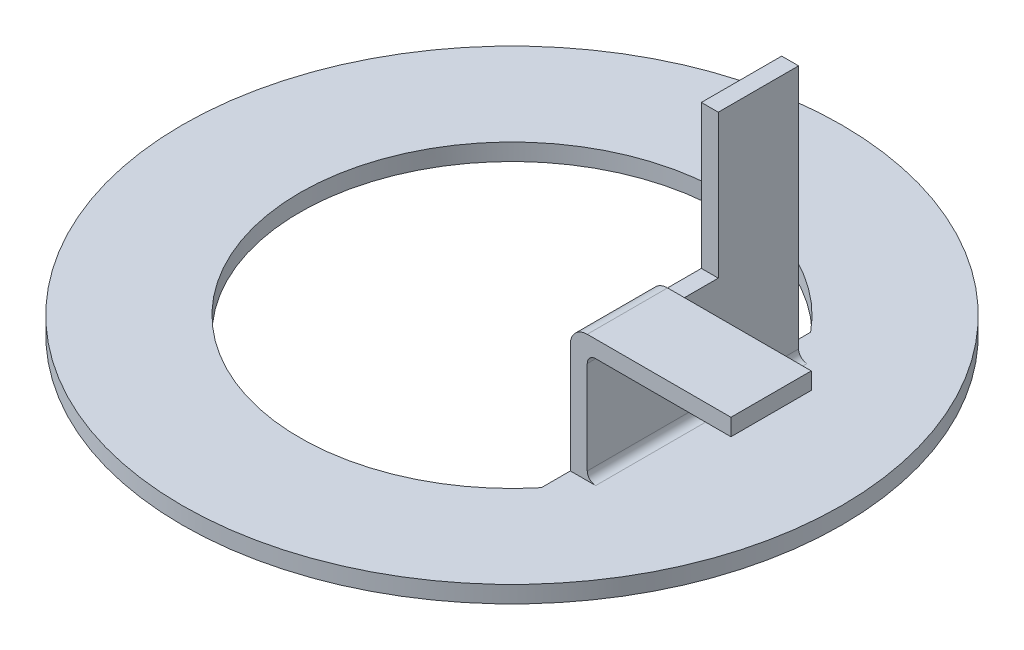
ISO-10303-21;
HEADER;
FILE_DESCRIPTION(('STEP AP214'),'2;1');
FILE_NAME('part.step','',(''),(''),'','','');
FILE_SCHEMA(('AUTOMOTIVE_DESIGN { 1 0 10303 214 1 1 1 1 }'));
ENDSEC;
DATA;
#1=APPLICATION_CONTEXT('core data for automotive mechanical design processes');
#2=APPLICATION_PROTOCOL_DEFINITION('international standard','automotive_design',2000,#1);
#3=PRODUCT_CONTEXT('',#1,'mechanical');
#4=PRODUCT('Part','Part','',(#3));
#5=PRODUCT_RELATED_PRODUCT_CATEGORY('part','',(#4));
#6=PRODUCT_DEFINITION_FORMATION('','',#4);
#7=PRODUCT_DEFINITION_CONTEXT('part definition',#1,'design');
#8=PRODUCT_DEFINITION('design','',#6,#7);
#9=PRODUCT_DEFINITION_SHAPE('','',#8);
#10=(LENGTH_UNIT() NAMED_UNIT(*) SI_UNIT(.MILLI.,.METRE.));
#11=(NAMED_UNIT(*) PLANE_ANGLE_UNIT() SI_UNIT($,.RADIAN.));
#12=(NAMED_UNIT(*) SI_UNIT($,.STERADIAN.) SOLID_ANGLE_UNIT());
#13=UNCERTAINTY_MEASURE_WITH_UNIT(LENGTH_MEASURE(1.E-05),#10,'distance_accuracy_value','');
#14=(GEOMETRIC_REPRESENTATION_CONTEXT(3) GLOBAL_UNCERTAINTY_ASSIGNED_CONTEXT((#13)) GLOBAL_UNIT_ASSIGNED_CONTEXT((#10,
#11,#12)) REPRESENTATION_CONTEXT('',''));
#15=CARTESIAN_POINT('',(0.,0.,0.));
#16=DIRECTION('',(0.,0.,1.));
#17=DIRECTION('',(1.,0.,0.));
#18=AXIS2_PLACEMENT_3D('',#15,#16,#17);
#19=CARTESIAN_POINT('',(9.85520000000012,8.6360000000002,1.52399999999986));
#20=DIRECTION('',(0.,0.,1.));
#21=DIRECTION('',(1.,0.,0.));
#22=AXIS2_PLACEMENT_3D('',#19,#20,#21);
#23=PLANE('',#22);
#24=CARTESIAN_POINT('',(10.8711999999994,7.62000000000007,1.52400000000008));
#25=DIRECTION('',(0.,0.,1.));
#26=DIRECTION('',(1.,0.,0.));
#27=AXIS2_PLACEMENT_3D('',#24,#25,#26);
#28=CIRCLE('',#27,1.016);
#29=CARTESIAN_POINT('',(10.8711999999996,8.63600000000009,1.52399999999986));
#30=VERTEX_POINT('',#29);
#31=CARTESIAN_POINT('',(9.85519999999934,7.61999999999996,1.52399999999964));
#32=VERTEX_POINT('',#31);
#33=EDGE_CURVE('E20',#30,#32,#28,.T.);
#34=ORIENTED_EDGE('',*,*,#33,.F.);
#35=DIRECTION('',(1.,0.,0.));
#36=VECTOR('',#35,1.);
#37=CARTESIAN_POINT('',(9.85520000000012,8.6360000000002,1.52399999999986));
#38=LINE('',#37,#36);
#39=CARTESIAN_POINT('',(19.5071999999998,8.6360000000002,1.52400000000008));
#40=VERTEX_POINT('',#39);
#41=EDGE_CURVE('E93',#40,#30,#38,.F.);
#42=ORIENTED_EDGE('',*,*,#41,.F.);
#43=DIRECTION('',(0.,1.,0.));
#44=VECTOR('',#43,1.);
#45=CARTESIAN_POINT('',(19.5071999999998,8.6360000000002,1.52400000000008));
#46=LINE('',#45,#44);
#47=CARTESIAN_POINT('',(19.5071999999998,7.61999999999996,1.52399999999986));
#48=VERTEX_POINT('',#47);
#49=EDGE_CURVE('E145',#40,#48,#46,.F.);
#50=ORIENTED_EDGE('',*,*,#49,.T.);
#51=DIRECTION('',(1.,0.,0.));
#52=VECTOR('',#51,1.);
#53=CARTESIAN_POINT('',(9.85519999999934,7.61999999999996,1.52399999999964));
#54=LINE('',#53,#52);
#55=CARTESIAN_POINT('',(11.3791999999996,7.62000000000018,1.5240000000003));
#56=VERTEX_POINT('',#55);
#57=EDGE_CURVE('E135',#48,#56,#54,.F.);
#58=ORIENTED_EDGE('',*,*,#57,.T.);
#59=CARTESIAN_POINT('',(11.3791999999996,7.11200000000045,1.5240000000003));
#60=DIRECTION('',(0.,0.,-1.));
#61=DIRECTION('',(-1.,0.,0.));
#62=AXIS2_PLACEMENT_3D('',#59,#60,#61);
#63=CIRCLE('',#62,0.508);
#64=CARTESIAN_POINT('',(10.8711999999996,7.11200000000012,1.52399999999986));
#65=VERTEX_POINT('',#64);
#66=EDGE_CURVE('E139',#56,#65,#63,.F.);
#67=ORIENTED_EDGE('',*,*,#66,.T.);
#68=DIRECTION('',(0.,1.,0.));
#69=VECTOR('',#68,1.);
#70=CARTESIAN_POINT('',(10.8711999999996,8.63600000000009,1.52399999999986));
#71=LINE('',#70,#69);
#72=CARTESIAN_POINT('',(10.8711999999994,7.62000000000007,1.52400000000008));
#73=VERTEX_POINT('',#72);
#74=EDGE_CURVE('E101',#73,#65,#71,.F.);
#75=ORIENTED_EDGE('',*,*,#74,.F.);
#76=DIRECTION('',(1.,0.,0.));
#77=VECTOR('',#76,1.);
#78=CARTESIAN_POINT('',(9.85519999999934,7.61999999999996,1.52399999999964));
#79=LINE('',#78,#77);
#80=EDGE_CURVE('E96',#32,#73,#79,.T.);
#81=ORIENTED_EDGE('',*,*,#80,.F.);
#82=EDGE_LOOP('',(#34,#42,#50,#58,#67,#75,#81));
#83=FACE_BOUND('',#82,.T.);
#84=ADVANCED_FACE('F17',(#83),#23,.F.);
#85=CARTESIAN_POINT('',(19.5071999999998,8.6360000000002,1.52400000000008));
#86=DIRECTION('',(-1.,0.,0.));
#87=DIRECTION('',(0.,0.,1.));
#88=AXIS2_PLACEMENT_3D('',#85,#86,#87);
#89=PLANE('',#88);
#90=ORIENTED_EDGE('',*,*,#49,.F.);
#91=DIRECTION('',(0.,0.,1.));
#92=VECTOR('',#91,1.);
#93=CARTESIAN_POINT('',(19.5071999999998,8.63600000000031,6.3500000000003));
#94=LINE('',#93,#92);
#95=CARTESIAN_POINT('',(19.5071999999998,8.63600000000031,6.3500000000003));
#96=VERTEX_POINT('',#95);
#97=EDGE_CURVE('E109',#96,#40,#94,.F.);
#98=ORIENTED_EDGE('',*,*,#97,.F.);
#99=DIRECTION('',(0.,1.,0.));
#100=VECTOR('',#99,1.);
#101=CARTESIAN_POINT('',(19.5071999999998,8.63600000000031,6.3500000000003));
#102=LINE('',#101,#100);
#103=CARTESIAN_POINT('',(19.5071999999998,7.62000000000029,6.34999999999986));
#104=VERTEX_POINT('',#103);
#105=EDGE_CURVE('E142',#104,#96,#102,.T.);
#106=ORIENTED_EDGE('',*,*,#105,.F.);
#107=DIRECTION('',(0.,0.,1.));
#108=VECTOR('',#107,1.);
#109=CARTESIAN_POINT('',(19.5071999999998,7.62000000000029,6.34999999999986));
#110=LINE('',#109,#108);
#111=EDGE_CURVE('E136',#104,#48,#110,.F.);
#112=ORIENTED_EDGE('',*,*,#111,.T.);
#113=EDGE_LOOP('',(#90,#98,#106,#112));
#114=FACE_BOUND('',#113,.T.);
#115=ADVANCED_FACE('F247',(#114),#89,.F.);
#116=CARTESIAN_POINT('',(11.3791999999996,7.11200000000067,-6.34999999999986));
#117=DIRECTION('',(0.,0.,-1.));
#118=DIRECTION('',(-1.,0.,0.));
#119=AXIS2_PLACEMENT_3D('',#116,#117,#118);
#120=CYLINDRICAL_SURFACE('',#119,0.508);
#121=DIRECTION('',(0.,0.,1.));
#122=VECTOR('',#121,1.);
#123=CARTESIAN_POINT('',(11.3791999999999,7.61999999999996,6.35000000000008));
#124=LINE('',#123,#122);
#125=CARTESIAN_POINT('',(11.3791999999999,7.61999999999996,6.35000000000008));
#126=VERTEX_POINT('',#125);
#127=EDGE_CURVE('E110',#56,#126,#124,.T.);
#128=ORIENTED_EDGE('',*,*,#127,.T.);
#129=CARTESIAN_POINT('',(11.3791999999988,7.1119999999999,6.34999999999986));
#130=DIRECTION('',(0.,0.,-1.));
#131=DIRECTION('',(-1.,0.,0.));
#132=AXIS2_PLACEMENT_3D('',#129,#130,#131);
#133=CIRCLE('',#132,0.508);
#134=CARTESIAN_POINT('',(10.8711999999992,7.11200000000023,6.34999999999986));
#135=VERTEX_POINT('',#134);
#136=EDGE_CURVE('E149',#135,#126,#133,.T.);
#137=ORIENTED_EDGE('',*,*,#136,.F.);
#138=DIRECTION('',(0.,0.,1.));
#139=VECTOR('',#138,1.);
#140=CARTESIAN_POINT('',(10.8711999999997,7.11200000000056,-6.35000000000008));
#141=LINE('',#140,#139);
#142=EDGE_CURVE('E127',#135,#65,#141,.F.);
#143=ORIENTED_EDGE('',*,*,#142,.T.);
#144=ORIENTED_EDGE('',*,*,#66,.F.);
#145=EDGE_LOOP('',(#128,#137,#143,#144));
#146=FACE_BOUND('',#145,.T.);
#147=ADVANCED_FACE('F244',(#146),#120,.F.);
#148=CARTESIAN_POINT('',(9.8551999999994,7.62000000000007,6.34999999999963));
#149=DIRECTION('',(0.,1.,0.));
#150=DIRECTION('',(0.,0.,1.));
#151=AXIS2_PLACEMENT_3D('',#148,#149,#150);
#152=PLANE('',#151);
#153=ORIENTED_EDGE('',*,*,#127,.F.);
#154=ORIENTED_EDGE('',*,*,#57,.F.);
#155=ORIENTED_EDGE('',*,*,#111,.F.);
#156=DIRECTION('',(-1.,0.,0.));
#157=VECTOR('',#156,1.);
#158=CARTESIAN_POINT('',(9.8551999999994,7.62000000000007,6.34999999999963));
#159=LINE('',#158,#157);
#160=EDGE_CURVE('E306',#104,#126,#159,.T.);
#161=ORIENTED_EDGE('',*,*,#160,.T.);
#162=EDGE_LOOP('',(#153,#154,#155,#161));
#163=FACE_BOUND('',#162,.T.);
#164=ADVANCED_FACE('F241',(#163),#152,.F.);
#165=CARTESIAN_POINT('',(9.85519999999973,8.63600000000009,6.34999999999986));
#166=DIRECTION('',(0.,1.,0.));
#167=DIRECTION('',(0.,0.,1.));
#168=AXIS2_PLACEMENT_3D('',#165,#166,#167);
#169=PLANE('',#168);
#170=DIRECTION('',(-1.,0.,0.));
#171=VECTOR('',#170,1.);
#172=CARTESIAN_POINT('',(9.85519999999973,8.63600000000009,6.34999999999986));
#173=LINE('',#172,#171);
#174=CARTESIAN_POINT('',(10.8711999999994,8.6360000000002,6.34999999999986));
#175=VERTEX_POINT('',#174);
#176=EDGE_CURVE('E121',#175,#96,#173,.F.);
#177=ORIENTED_EDGE('',*,*,#176,.T.);
#178=ORIENTED_EDGE('',*,*,#97,.T.);
#179=ORIENTED_EDGE('',*,*,#41,.T.);
#180=DIRECTION('',(0.,0.,1.));
#181=VECTOR('',#180,1.);
#182=CARTESIAN_POINT('',(10.8711999999994,8.6360000000002,6.34999999999986));
#183=LINE('',#182,#181);
#184=EDGE_CURVE('E107',#175,#30,#183,.F.);
#185=ORIENTED_EDGE('',*,*,#184,.F.);
#186=EDGE_LOOP('',(#177,#178,#179,#185));
#187=FACE_BOUND('',#186,.T.);
#188=ADVANCED_FACE('F106',(#187),#169,.T.);
#189=CARTESIAN_POINT('',(10.8711999999997,16.2560000000003,-6.35000000000008));
#190=DIRECTION('',(-1.,0.,0.));
#191=DIRECTION('',(0.,0.,1.));
#192=AXIS2_PLACEMENT_3D('',#189,#190,#191);
#193=PLANE('',#192);
#194=ORIENTED_EDGE('',*,*,#142,.F.);
#195=DIRECTION('',(0.,1.,0.));
#196=VECTOR('',#195,1.);
#197=CARTESIAN_POINT('',(10.8711999999996,16.256,6.3500000000003));
#198=LINE('',#197,#196);
#199=CARTESIAN_POINT('',(10.8711999999992,1.52400000000041,6.35000000000008));
#200=VERTEX_POINT('',#199);
#201=EDGE_CURVE('E301',#135,#200,#198,.F.);
#202=ORIENTED_EDGE('',*,*,#201,.T.);
#203=DIRECTION('',(0.,0.,-1.));
#204=VECTOR('',#203,1.);
#205=CARTESIAN_POINT('',(10.8711999999997,1.52400000000019,-6.35000000000008));
#206=LINE('',#205,#204);
#207=CARTESIAN_POINT('',(10.8711999999997,1.52400000000019,-6.35000000000008));
#208=VERTEX_POINT('',#207);
#209=EDGE_CURVE('E330',#200,#208,#206,.T.);
#210=ORIENTED_EDGE('',*,*,#209,.T.);
#211=DIRECTION('',(0.,1.,0.));
#212=VECTOR('',#211,1.);
#213=CARTESIAN_POINT('',(10.8711999999997,16.2560000000003,-6.35000000000008));
#214=LINE('',#213,#212);
#215=CARTESIAN_POINT('',(10.8711999999997,16.2560000000003,-6.35000000000008));
#216=VERTEX_POINT('',#215);
#217=EDGE_CURVE('E132',#208,#216,#214,.T.);
#218=ORIENTED_EDGE('',*,*,#217,.T.);
#219=DIRECTION('',(0.,0.,1.));
#220=VECTOR('',#219,1.);
#221=CARTESIAN_POINT('',(10.8711999999996,16.256,6.3500000000003));
#222=LINE('',#221,#220);
#223=CARTESIAN_POINT('',(10.8712,16.2560000000003,-1.52399999999986));
#224=VERTEX_POINT('',#223);
#225=EDGE_CURVE('E331',#224,#216,#222,.F.);
#226=ORIENTED_EDGE('',*,*,#225,.F.);
#227=DIRECTION('',(0.,1.,0.));
#228=VECTOR('',#227,1.);
#229=CARTESIAN_POINT('',(10.8711999999993,17.4047218500607,-1.52400000000052));
#230=LINE('',#229,#228);
#231=CARTESIAN_POINT('',(10.8711999999998,7.62000000000029,-1.52400000000008));
#232=VERTEX_POINT('',#231);
#233=EDGE_CURVE('E119',#224,#232,#230,.F.);
#234=ORIENTED_EDGE('',*,*,#233,.T.);
#235=DIRECTION('',(0.,0.,-1.));
#236=VECTOR('',#235,1.);
#237=CARTESIAN_POINT('',(10.8711999999998,7.62000000000029,-1.52400000000008));
#238=LINE('',#237,#236);
#239=EDGE_CURVE('E116',#232,#73,#238,.F.);
#240=ORIENTED_EDGE('',*,*,#239,.T.);
#241=ORIENTED_EDGE('',*,*,#74,.T.);
#242=EDGE_LOOP('',(#194,#202,#210,#218,#226,#234,#240,#241));
#243=FACE_BOUND('',#242,.T.);
#244=ADVANCED_FACE('F234',(#243),#193,.F.);
#245=CARTESIAN_POINT('',(9.85519999999929,16.256,-6.3500000000003));
#246=DIRECTION('',(0.,0.,1.));
#247=DIRECTION('',(1.,0.,0.));
#248=AXIS2_PLACEMENT_3D('',#245,#246,#247);
#249=PLANE('',#248);
#250=DIRECTION('',(0.,1.,0.));
#251=VECTOR('',#250,1.);
#252=CARTESIAN_POINT('',(9.85519999999945,1.01599999999991,-6.34999999999986));
#253=LINE('',#252,#251);
#254=CARTESIAN_POINT('',(9.85519999999929,16.256,-6.3500000000003));
#255=VERTEX_POINT('',#254);
#256=CARTESIAN_POINT('',(9.85519999999945,1.01599999999991,-6.34999999999986));
#257=VERTEX_POINT('',#256);
#258=EDGE_CURVE('E287',#255,#257,#253,.F.);
#259=ORIENTED_EDGE('',*,*,#258,.F.);
#260=DIRECTION('',(1.,0.,0.));
#261=VECTOR('',#260,1.);
#262=CARTESIAN_POINT('',(9.85519999999929,16.256,-6.3500000000003));
#263=LINE('',#262,#261);
#264=EDGE_CURVE('E327',#216,#255,#263,.F.);
#265=ORIENTED_EDGE('',*,*,#264,.F.);
#266=ORIENTED_EDGE('',*,*,#217,.F.);
#267=CARTESIAN_POINT('',(11.3791999999992,1.5240000000003,-6.34999999999986));
#268=DIRECTION('',(0.,0.,-1.));
#269=DIRECTION('',(-1.,0.,0.));
#270=AXIS2_PLACEMENT_3D('',#267,#268,#269);
#271=CIRCLE('',#270,0.508);
#272=CARTESIAN_POINT('',(11.3791999999992,1.01600000000046,-6.34999999999986));
#273=VERTEX_POINT('',#272);
#274=EDGE_CURVE('E339',#208,#273,#271,.F.);
#275=ORIENTED_EDGE('',*,*,#274,.T.);
#276=DIRECTION('',(1.,0.,0.));
#277=VECTOR('',#276,1.);
#278=CARTESIAN_POINT('',(9.85519999999945,1.01599999999991,-6.34999999999986));
#279=LINE('',#278,#277);
#280=EDGE_CURVE('E309',#257,#273,#279,.T.);
#281=ORIENTED_EDGE('',*,*,#280,.F.);
#282=EDGE_LOOP('',(#259,#265,#266,#275,#281));
#283=FACE_BOUND('',#282,.T.);
#284=ADVANCED_FACE('F230',(#283),#249,.F.);
#285=CARTESIAN_POINT('',(9.8551999999994,16.2560000000002,6.34999999999963));
#286=DIRECTION('',(0.,0.,-1.));
#287=DIRECTION('',(-1.,0.,0.));
#288=AXIS2_PLACEMENT_3D('',#285,#286,#287);
#289=PLANE('',#288);
#290=CARTESIAN_POINT('',(10.8711999999997,7.62000000000018,6.34999999999986));
#291=DIRECTION('',(0.,0.,1.));
#292=DIRECTION('',(1.,0.,0.));
#293=AXIS2_PLACEMENT_3D('',#290,#291,#292);
#294=CIRCLE('',#293,1.016);
#295=CARTESIAN_POINT('',(9.8551999999994,7.62000000000007,6.34999999999963));
#296=VERTEX_POINT('',#295);
#297=EDGE_CURVE('E115',#296,#175,#294,.F.);
#298=ORIENTED_EDGE('',*,*,#297,.F.);
#299=DIRECTION('',(0.,1.,0.));
#300=VECTOR('',#299,1.);
#301=CARTESIAN_POINT('',(9.85519999999956,1.01599999999991,6.3500000000003));
#302=LINE('',#301,#300);
#303=CARTESIAN_POINT('',(9.85519999999956,1.01599999999991,6.3500000000003));
#304=VERTEX_POINT('',#303);
#305=EDGE_CURVE('E285',#304,#296,#302,.T.);
#306=ORIENTED_EDGE('',*,*,#305,.F.);
#307=DIRECTION('',(-1.,0.,0.));
#308=VECTOR('',#307,1.);
#309=CARTESIAN_POINT('',(9.85519999999956,1.01599999999991,6.3500000000003));
#310=LINE('',#309,#308);
#311=CARTESIAN_POINT('',(11.3792,1.01600000000002,6.34999999999986));
#312=VERTEX_POINT('',#311);
#313=EDGE_CURVE('E296',#312,#304,#310,.T.);
#314=ORIENTED_EDGE('',*,*,#313,.F.);
#315=CARTESIAN_POINT('',(11.3791999999988,1.52399999999986,6.3500000000003));
#316=DIRECTION('',(0.,0.,-1.));
#317=DIRECTION('',(-1.,0.,0.));
#318=AXIS2_PLACEMENT_3D('',#315,#316,#317);
#319=CIRCLE('',#318,0.508);
#320=EDGE_CURVE('E292',#312,#200,#319,.T.);
#321=ORIENTED_EDGE('',*,*,#320,.T.);
#322=ORIENTED_EDGE('',*,*,#201,.F.);
#323=ORIENTED_EDGE('',*,*,#136,.T.);
#324=ORIENTED_EDGE('',*,*,#160,.F.);
#325=ORIENTED_EDGE('',*,*,#105,.T.);
#326=ORIENTED_EDGE('',*,*,#176,.F.);
#327=EDGE_LOOP('',(#298,#306,#314,#321,#322,#323,#324,#325,#326));
#328=FACE_BOUND('',#327,.T.);
#329=ADVANCED_FACE('F227',(#328),#289,.F.);
#330=CARTESIAN_POINT('',(10.8711999999997,7.62000000000018,6.34999999999986));
#331=DIRECTION('',(0.,0.,1.));
#332=DIRECTION('',(1.,0.,0.));
#333=AXIS2_PLACEMENT_3D('',#330,#331,#332);
#334=CYLINDRICAL_SURFACE('',#333,1.016);
#335=ORIENTED_EDGE('',*,*,#297,.T.);
#336=ORIENTED_EDGE('',*,*,#184,.T.);
#337=ORIENTED_EDGE('',*,*,#33,.T.);
#338=DIRECTION('',(0.,0.,1.));
#339=VECTOR('',#338,1.);
#340=CARTESIAN_POINT('',(9.85519999999956,7.62000000000007,8.0906077398426));
#341=LINE('',#340,#339);
#342=EDGE_CURVE('E168',#296,#32,#341,.F.);
#343=ORIENTED_EDGE('',*,*,#342,.F.);
#344=EDGE_LOOP('',(#335,#336,#337,#343));
#345=FACE_BOUND('',#344,.T.);
#346=ADVANCED_FACE('F113',(#345),#334,.T.);
#347=CARTESIAN_POINT('',(25.0951999999992,7.62000000000007,-1.52399999999986));
#348=DIRECTION('',(0.,-1.,0.));
#349=DIRECTION('',(0.,0.,-1.));
#350=AXIS2_PLACEMENT_3D('',#347,#348,#349);
#351=PLANE('',#350);
#352=ORIENTED_EDGE('',*,*,#239,.F.);
#353=DIRECTION('',(1.,0.,0.));
#354=VECTOR('',#353,1.);
#355=CARTESIAN_POINT('',(25.0951999999992,7.62000000000007,-1.52399999999986));
#356=LINE('',#355,#354);
#357=CARTESIAN_POINT('',(9.85520000000001,7.62000000000052,-1.5240000000003));
#358=VERTEX_POINT('',#357);
#359=EDGE_CURVE('E347',#232,#358,#356,.F.);
#360=ORIENTED_EDGE('',*,*,#359,.T.);
#361=DIRECTION('',(0.,0.,1.));
#362=VECTOR('',#361,1.);
#363=CARTESIAN_POINT('',(9.85519999999956,7.62000000000007,8.0906077398426));
#364=LINE('',#363,#362);
#365=EDGE_CURVE('E164',#32,#358,#364,.F.);
#366=ORIENTED_EDGE('',*,*,#365,.F.);
#367=ORIENTED_EDGE('',*,*,#80,.T.);
#368=EDGE_LOOP('',(#352,#360,#366,#367));
#369=FACE_BOUND('',#368,.T.);
#370=ADVANCED_FACE('F220',(#369),#351,.F.);
#371=CARTESIAN_POINT('',(25.0951999999998,17.4047218500605,-1.52400000000008));
#372=DIRECTION('',(0.,0.,-1.));
#373=DIRECTION('',(0.,1.,0.));
#374=AXIS2_PLACEMENT_3D('',#371,#372,#373);
#375=PLANE('',#374);
#376=DIRECTION('',(0.,1.,0.));
#377=VECTOR('',#376,1.);
#378=CARTESIAN_POINT('',(9.85519999999934,1.01600000000057,-1.5240000000003));
#379=LINE('',#378,#377);
#380=CARTESIAN_POINT('',(9.85519999999967,16.2560000000003,-1.52400000000008));
#381=VERTEX_POINT('',#380);
#382=EDGE_CURVE('E167',#358,#381,#379,.T.);
#383=ORIENTED_EDGE('',*,*,#382,.F.);
#384=ORIENTED_EDGE('',*,*,#359,.F.);
#385=ORIENTED_EDGE('',*,*,#233,.F.);
#386=DIRECTION('',(1.,0.,0.));
#387=VECTOR('',#386,1.);
#388=CARTESIAN_POINT('',(9.85519999999967,16.2560000000003,-1.52400000000008));
#389=LINE('',#388,#387);
#390=EDGE_CURVE('E342',#381,#224,#389,.T.);
#391=ORIENTED_EDGE('',*,*,#390,.F.);
#392=EDGE_LOOP('',(#383,#384,#385,#391));
#393=FACE_BOUND('',#392,.T.);
#394=ADVANCED_FACE('F216',(#393),#375,.F.);
#395=CARTESIAN_POINT('',(9.8551999999994,16.2560000000002,6.34999999999963));
#396=DIRECTION('',(0.,1.,0.));
#397=DIRECTION('',(0.,0.,1.));
#398=AXIS2_PLACEMENT_3D('',#395,#396,#397);
#399=PLANE('',#398);
#400=ORIENTED_EDGE('',*,*,#264,.T.);
#401=DIRECTION('',(0.,0.,1.));
#402=VECTOR('',#401,1.);
#403=CARTESIAN_POINT('',(9.85519999999934,16.2560000000003,8.0906077398426));
#404=LINE('',#403,#402);
#405=EDGE_CURVE('E321',#381,#255,#404,.F.);
#406=ORIENTED_EDGE('',*,*,#405,.F.);
#407=ORIENTED_EDGE('',*,*,#390,.T.);
#408=ORIENTED_EDGE('',*,*,#225,.T.);
#409=EDGE_LOOP('',(#400,#406,#407,#408));
#410=FACE_BOUND('',#409,.T.);
#411=ADVANCED_FACE('F212',(#410),#399,.T.);
#412=CARTESIAN_POINT('',(11.3791999999992,1.5240000000003,-6.34999999999986));
#413=DIRECTION('',(0.,0.,-1.));
#414=DIRECTION('',(-1.,0.,0.));
#415=AXIS2_PLACEMENT_3D('',#412,#413,#414);
#416=CYLINDRICAL_SURFACE('',#415,0.508);
#417=DIRECTION('',(0.,0.,1.));
#418=VECTOR('',#417,1.);
#419=CARTESIAN_POINT('',(11.3791999999997,1.01600000000024,0.));
#420=LINE('',#419,#418);
#421=EDGE_CURVE('E324',#273,#312,#420,.T.);
#422=ORIENTED_EDGE('',*,*,#421,.F.);
#423=ORIENTED_EDGE('',*,*,#274,.F.);
#424=ORIENTED_EDGE('',*,*,#209,.F.);
#425=ORIENTED_EDGE('',*,*,#320,.F.);
#426=EDGE_LOOP('',(#422,#423,#424,#425));
#427=FACE_BOUND('',#426,.T.);
#428=ADVANCED_FACE('F208',(#427),#416,.F.);
#429=CARTESIAN_POINT('',(9.85519999999934,1.01600000000013,8.09060773984283));
#430=DIRECTION('',(-1.,0.,0.));
#431=DIRECTION('',(0.,0.,1.));
#432=AXIS2_PLACEMENT_3D('',#429,#430,#431);
#433=PLANE('',#432);
#434=ORIENTED_EDGE('',*,*,#382,.T.);
#435=ORIENTED_EDGE('',*,*,#405,.T.);
#436=ORIENTED_EDGE('',*,*,#258,.T.);
#437=DIRECTION('',(0.,0.,1.));
#438=VECTOR('',#437,1.);
#439=CARTESIAN_POINT('',(9.85519999999951,1.01600000000035,2.22044604925031E-13));
#440=LINE('',#439,#438);
#441=EDGE_CURVE('E273',#304,#257,#440,.F.);
#442=ORIENTED_EDGE('',*,*,#441,.F.);
#443=ORIENTED_EDGE('',*,*,#305,.T.);
#444=ORIENTED_EDGE('',*,*,#342,.T.);
#445=ORIENTED_EDGE('',*,*,#365,.T.);
#446=EDGE_LOOP('',(#434,#435,#436,#442,#443,#444,#445));
#447=FACE_BOUND('',#446,.T.);
#448=ADVANCED_FACE('F204',(#447),#433,.T.);
#449=CARTESIAN_POINT('',(0.,1.01600000000013,0.));
#450=DIRECTION('',(0.,1.,0.));
#451=DIRECTION('',(0.,0.,1.));
#452=AXIS2_PLACEMENT_3D('',#449,#450,#451);
#453=PLANE('',#452);
#454=CARTESIAN_POINT('',(0.,1.01600000000013,0.));
#455=DIRECTION('',(0.,-1.,0.));
#456=DIRECTION('',(0.,0.,-1.));
#457=AXIS2_PLACEMENT_3D('',#454,#455,#456);
#458=CIRCLE('',#457,19.812);
#459=CARTESIAN_POINT('',(0.,1.01600000000013,-19.812));
#460=VERTEX_POINT('',#459);
#461=EDGE_CURVE('E336',#460,#460,#458,.T.);
#462=ORIENTED_EDGE('',*,*,#461,.F.);
#463=EDGE_LOOP('',(#462));
#464=FACE_BOUND('',#463,.T.);
#465=CARTESIAN_POINT('',(0.,1.01600000000013,0.));
#466=DIRECTION('',(0.,-1.,0.));
#467=DIRECTION('',(0.,0.,-1.));
#468=AXIS2_PLACEMENT_3D('',#465,#466,#467);
#469=CIRCLE('',#468,12.7508);
#470=CARTESIAN_POINT('',(9.85519999999934,1.01600000000013,8.09060773984283));
#471=VERTEX_POINT('',#470);
#472=CARTESIAN_POINT('',(9.85519999999984,1.01600000000002,-8.09060773984283));
#473=VERTEX_POINT('',#472);
#474=EDGE_CURVE('E275',#471,#473,#469,.T.);
#475=ORIENTED_EDGE('',*,*,#474,.T.);
#476=DIRECTION('',(0.,0.,1.));
#477=VECTOR('',#476,1.);
#478=CARTESIAN_POINT('',(9.85519999999951,1.01600000000035,2.22044604925031E-13));
#479=LINE('',#478,#477);
#480=EDGE_CURVE('E271',#257,#473,#479,.F.);
#481=ORIENTED_EDGE('',*,*,#480,.F.);
#482=ORIENTED_EDGE('',*,*,#280,.T.);
#483=ORIENTED_EDGE('',*,*,#421,.T.);
#484=ORIENTED_EDGE('',*,*,#313,.T.);
#485=DIRECTION('',(0.,0.,1.));
#486=VECTOR('',#485,1.);
#487=CARTESIAN_POINT('',(9.85519999999951,1.01600000000035,2.22044604925031E-13));
#488=LINE('',#487,#486);
#489=EDGE_CURVE('E173',#471,#304,#488,.F.);
#490=ORIENTED_EDGE('',*,*,#489,.F.);
#491=EDGE_LOOP('',(#475,#481,#482,#483,#484,#490));
#492=FACE_BOUND('',#491,.T.);
#493=ADVANCED_FACE('F200',(#464,#492),#453,.T.);
#494=CARTESIAN_POINT('',(0.,1.01600000000013,0.));
#495=DIRECTION('',(0.,-1.,0.));
#496=DIRECTION('',(0.,0.,-1.));
#497=AXIS2_PLACEMENT_3D('',#494,#495,#496);
#498=CYLINDRICAL_SURFACE('',#497,19.812);
#499=ORIENTED_EDGE('',*,*,#461,.T.);
#500=EDGE_LOOP('',(#499));
#501=FACE_BOUND('',#500,.T.);
#502=CARTESIAN_POINT('',(0.,0.,0.));
#503=DIRECTION('',(0.,-1.,0.));
#504=DIRECTION('',(0.,0.,-1.));
#505=AXIS2_PLACEMENT_3D('',#502,#503,#504);
#506=CIRCLE('',#505,19.812);
#507=CARTESIAN_POINT('',(0.,0.,-19.812));
#508=VERTEX_POINT('',#507);
#509=EDGE_CURVE('E170',#508,#508,#506,.F.);
#510=ORIENTED_EDGE('',*,*,#509,.T.);
#511=EDGE_LOOP('',(#510));
#512=FACE_BOUND('',#511,.T.);
#513=ADVANCED_FACE('F196',(#501,#512),#498,.T.);
#514=CARTESIAN_POINT('',(0.,1.01600000000013,0.));
#515=DIRECTION('',(0.,-1.,0.));
#516=DIRECTION('',(0.,0.,-1.));
#517=AXIS2_PLACEMENT_3D('',#514,#515,#516);
#518=CYLINDRICAL_SURFACE('',#517,12.7508);
#519=ORIENTED_EDGE('',*,*,#474,.F.);
#520=CARTESIAN_POINT('',(10.8711999999993,0.,6.6633258362474));
#521=CARTESIAN_POINT('',(10.8488308796158,2.13293432265466E-06,6.699821297342));
#522=CARTESIAN_POINT('',(10.8262791213177,0.000738606319392317,6.73620148712229));
#523=CARTESIAN_POINT('',(10.7808339987111,0.00376997306110476,6.80869663647264));
#524=CARTESIAN_POINT('',(10.7579405367852,0.00606532042314272,6.84481151567565));
#525=CARTESIAN_POINT('',(10.688540903218,0.0154592128215091,6.95308296792015));
#526=CARTESIAN_POINT('',(10.6415704827442,0.0250677270178558,7.02475036131306));
#527=CARTESIAN_POINT('',(10.546318878933,0.0520557255145848,7.16697074508286));
#528=CARTESIAN_POINT('',(10.4980288217883,0.0695236983727123,7.23750129775174));
#529=CARTESIAN_POINT('',(10.4015155964272,0.113525659183283,7.37552870507302));
#530=CARTESIAN_POINT('',(10.3532926221646,0.1400340064536,7.44303353534227));
#531=CARTESIAN_POINT('',(10.2731410580991,0.193739046327416,7.55304853403827));
#532=CARTESIAN_POINT('',(10.2408813720711,0.218068037473433,7.59671304395555));
#533=CARTESIAN_POINT('',(10.1776087092821,0.272411113144595,7.68127325605329));
#534=CARTESIAN_POINT('',(10.1465940845613,0.302417360865384,7.72217267072706));
#535=CARTESIAN_POINT('',(10.0864202148347,0.369149246298519,7.80060849478543));
#536=CARTESIAN_POINT('',(10.0572810706879,0.405935192456989,7.83810981389465));
#537=CARTESIAN_POINT('',(10.0026184588354,0.48667190241576,7.90774784608552));
#538=CARTESIAN_POINT('',(9.9770899634731,0.530612516433114,7.93989203007847));
#539=CARTESIAN_POINT('',(9.93840135146027,0.611627424723761,7.9882251632938));
#540=CARTESIAN_POINT('',(9.92381780884135,0.646877918591521,8.00631949808082));
#541=CARTESIAN_POINT('',(9.89831830902417,0.720584157792356,8.03782342961862));
#542=CARTESIAN_POINT('',(9.88739255650303,0.759030992768676,8.05124554217598));
#543=CARTESIAN_POINT('',(9.87109636504548,0.833483949216095,8.07121457524339));
#544=CARTESIAN_POINT('',(9.86520337784961,0.86919734012463,8.07840973961337));
#545=CARTESIAN_POINT('',(9.85923753001851,0.923660960474041,8.0856876637688));
#546=CARTESIAN_POINT('',(9.85772765668145,0.942038187073691,8.08752804975325));
#547=CARTESIAN_POINT('',(9.85570751033517,0.978940609573171,8.08998957433547));
#548=CARTESIAN_POINT('',(9.8551978956047,0.997465894866281,8.09060991000825));
#549=CARTESIAN_POINT('',(9.85519999999934,1.01600000000013,8.09060773984283));
#550=B_SPLINE_CURVE_WITH_KNOTS('',3,(#520,#521,#522,#523,#524,#525,#526,#527,#528,#529,#530,
#531,#532,#533,#534,#535,#536,#537,#538,#539,#540,#541,#542,#543,#544,#545,#546,#547,#548,#549),
.UNSPECIFIED.,.F.,.F.,(4,2,2,2,2,2,2,2,2,2,2,2,2,2,4),(0.,0.128401690457128,0.256840792580656,
0.515178888437996,0.77650132496724,1.03708866837928,1.21528311049297,1.39323334680647,
1.57285046289404,1.75221495503471,1.87842830104989,2.00430090070351,2.11449065236462,
2.17002231689602,2.22559051505295),.UNSPECIFIED.);
#551=CARTESIAN_POINT('',(10.8711999999993,0.,6.6633258362474));
#552=VERTEX_POINT('',#551);
#553=EDGE_CURVE('E174',#552,#471,#550,.T.);
#554=ORIENTED_EDGE('',*,*,#553,.F.);
#555=CARTESIAN_POINT('',(0.,0.,0.));
#556=DIRECTION('',(0.,-1.,0.));
#557=DIRECTION('',(0.,0.,-1.));
#558=AXIS2_PLACEMENT_3D('',#555,#556,#557);
#559=CIRCLE('',#558,12.7508);
#560=CARTESIAN_POINT('',(10.8712,2.22044604925031E-13,-6.66332583624718));
#561=VERTEX_POINT('',#560);
#562=EDGE_CURVE('E26',#552,#561,#559,.T.);
#563=ORIENTED_EDGE('',*,*,#562,.T.);
#564=CARTESIAN_POINT('',(9.85519999999984,1.01600000000002,-8.09060773984283));
#565=CARTESIAN_POINT('',(9.85519655136767,0.99477385611932,-8.0906112574084));
#566=CARTESIAN_POINT('',(9.85586582363041,0.973561916243331,-8.08979675103632));
#567=CARTESIAN_POINT('',(9.85851160163857,0.931361575751255,-8.08657259748118));
#568=CARTESIAN_POINT('',(9.86048686196667,0.910372981504843,-8.08416447000631));
#569=CARTESIAN_POINT('',(9.86825991064576,0.848423643715734,-8.07467744542057));
#570=CARTESIAN_POINT('',(9.87590681139305,0.808013017163419,-8.06533388561071));
#571=CARTESIAN_POINT('',(9.89542606838756,0.730106047755412,-8.04137275353791));
#572=CARTESIAN_POINT('',(9.90728377933632,0.692600146110981,-8.02677345845546));
#573=CARTESIAN_POINT('',(9.93440227527314,0.620852351513622,-7.99318587608264));
#574=CARTESIAN_POINT('',(9.94967202786623,0.586619405504245,-7.97418601823852));
#575=CARTESIAN_POINT('',(9.99048139420579,0.506647850465982,-7.9230472685814));
#576=CARTESIAN_POINT('',(10.0174968875652,0.462950271471041,-7.88890455431357));
#577=CARTESIAN_POINT('',(10.0749867011605,0.382963787905281,-7.81535301681994));
#578=CARTESIAN_POINT('',(10.105466839686,0.346687641087037,-7.77593531485931));
#579=CARTESIAN_POINT('',(10.1860294264585,0.262443484609513,-7.6703452636927));
#580=CARTESIAN_POINT('',(10.2375655321057,0.219234538980565,-7.60150991669705));
#581=CARTESIAN_POINT('',(10.3424840743799,0.146042432209967,-7.45814351415191));
#582=CARTESIAN_POINT('',(10.3958744394477,0.116126328296011,-7.3835857566513));
#583=CARTESIAN_POINT('',(10.4854514663624,0.0752386585803853,-7.25549581101265));
#584=CARTESIAN_POINT('',(10.5216598982435,0.0612684694489703,-7.2028956980238));
#585=CARTESIAN_POINT('',(10.5937579181633,0.0378794039950374,-7.09643061469894));
#586=CARTESIAN_POINT('',(10.6296472772735,0.0284635714905102,-7.04256482361357));
#587=CARTESIAN_POINT('',(10.7002613324316,0.0138442026956417,-6.93479552889076));
#588=CARTESIAN_POINT('',(10.7349954771837,0.0085746409029012,-6.8809068904431));
#589=CARTESIAN_POINT('',(10.8036946910839,0.00166218445932765,-6.77253327508581));
#590=CARTESIAN_POINT('',(10.8376609393271,1.32943121518607E-05,-6.71804943439222));
#591=CARTESIAN_POINT('',(10.8712,2.22044604925031E-13,-6.66332583624718));
#592=B_SPLINE_CURVE_WITH_KNOTS('',3,(#564,#565,#566,#567,#568,#569,#570,#571,#572,#573,#574,
#575,#576,#577,#578,#579,#580,#581,#582,#583,#584,#585,#586,#587,#588,#589,#590,#591),
.UNSPECIFIED.,.F.,.F.,(4,2,2,2,2,2,2,2,2,2,2,2,2,4),(0.,0.0636256200976459,0.12719065282765,
0.252945268445198,0.378266722591303,0.503921506610171,0.687938613329426,0.872269443229294,
1.15938024998435,1.44792341708837,1.64385737655861,1.83992210446205,2.03279766563316,
2.22535360115091),.UNSPECIFIED.);
#593=EDGE_CURVE('E183',#473,#561,#592,.T.);
#594=ORIENTED_EDGE('',*,*,#593,.F.);
#595=EDGE_LOOP('',(#519,#554,#563,#594));
#596=FACE_BOUND('',#595,.T.);
#597=ADVANCED_FACE('F192',(#596),#518,.F.);
#598=CARTESIAN_POINT('',(10.8712000000004,1.01600000000013,-2.22044604925031E-13));
#599=DIRECTION('',(0.,0.,1.));
#600=DIRECTION('',(1.,0.,0.));
#601=AXIS2_PLACEMENT_3D('',#598,#599,#600);
#602=CYLINDRICAL_SURFACE('',#601,1.016);
#603=ORIENTED_EDGE('',*,*,#553,.T.);
#604=ORIENTED_EDGE('',*,*,#489,.T.);
#605=ORIENTED_EDGE('',*,*,#441,.T.);
#606=ORIENTED_EDGE('',*,*,#480,.T.);
#607=ORIENTED_EDGE('',*,*,#593,.T.);
#608=DIRECTION('',(0.,0.,1.));
#609=VECTOR('',#608,1.);
#610=CARTESIAN_POINT('',(10.8711999999997,5.55111512312578E-13,0.));
#611=LINE('',#610,#609);
#612=EDGE_CURVE('E11',#561,#552,#611,.T.);
#613=ORIENTED_EDGE('',*,*,#612,.T.);
#614=EDGE_LOOP('',(#603,#604,#605,#606,#607,#613));
#615=FACE_BOUND('',#614,.T.);
#616=ADVANCED_FACE('F189',(#615),#602,.T.);
#617=CARTESIAN_POINT('',(0.,0.,0.));
#618=DIRECTION('',(0.,1.,0.));
#619=DIRECTION('',(0.,0.,1.));
#620=AXIS2_PLACEMENT_3D('',#617,#618,#619);
#621=PLANE('',#620);
#622=ORIENTED_EDGE('',*,*,#612,.F.);
#623=ORIENTED_EDGE('',*,*,#562,.F.);
#624=EDGE_LOOP('',(#622,#623));
#625=FACE_BOUND('',#624,.T.);
#626=ORIENTED_EDGE('',*,*,#509,.F.);
#627=EDGE_LOOP('',(#626));
#628=FACE_BOUND('',#627,.T.);
#629=ADVANCED_FACE('F256',(#625,#628),#621,.F.);
#630=CLOSED_SHELL('',(#84,#115,#147,#164,#188,#244,#284,#329,#346,#370,#394,#411,#428,#448,#493,
#513,#597,#616,#629));
#631=MANIFOLD_SOLID_BREP('B1',#630);
#632=ADVANCED_BREP_SHAPE_REPRESENTATION('',(#18,#631),#14);
#633=SHAPE_DEFINITION_REPRESENTATION(#9,#632);
ENDSEC;
END-ISO-10303-21;
